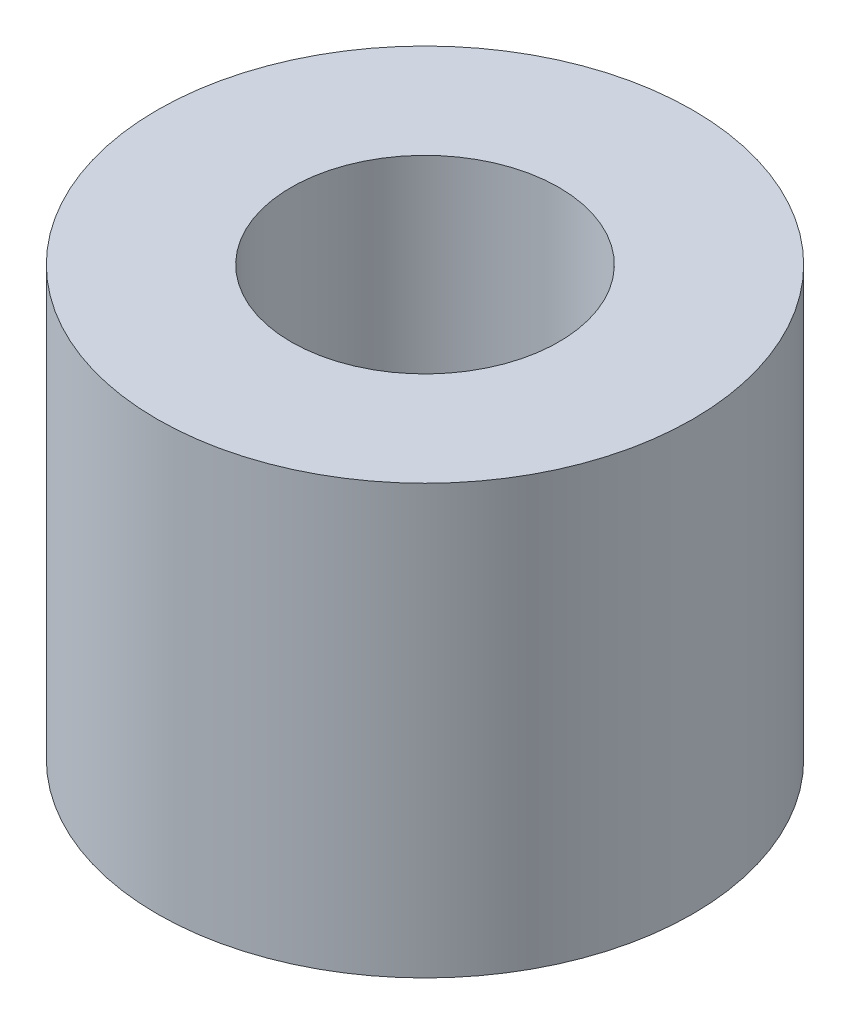
ISO-10303-21;
HEADER;
FILE_DESCRIPTION(('STEP AP214'),'2;1');
FILE_NAME('part.step','',(''),(''),'','','');
FILE_SCHEMA(('AUTOMOTIVE_DESIGN { 1 0 10303 214 1 1 1 1 }'));
ENDSEC;
DATA;
#1=APPLICATION_CONTEXT('core data for automotive mechanical design processes');
#2=APPLICATION_PROTOCOL_DEFINITION('international standard','automotive_design',2000,#1);
#3=PRODUCT_CONTEXT('',#1,'mechanical');
#4=PRODUCT('Part','Part','',(#3));
#5=PRODUCT_RELATED_PRODUCT_CATEGORY('part','',(#4));
#6=PRODUCT_DEFINITION_FORMATION('','',#4);
#7=PRODUCT_DEFINITION_CONTEXT('part definition',#1,'design');
#8=PRODUCT_DEFINITION('design','',#6,#7);
#9=PRODUCT_DEFINITION_SHAPE('','',#8);
#10=(LENGTH_UNIT() NAMED_UNIT(*) SI_UNIT(.MILLI.,.METRE.));
#11=(NAMED_UNIT(*) PLANE_ANGLE_UNIT() SI_UNIT($,.RADIAN.));
#12=(NAMED_UNIT(*) SI_UNIT($,.STERADIAN.) SOLID_ANGLE_UNIT());
#13=UNCERTAINTY_MEASURE_WITH_UNIT(LENGTH_MEASURE(1.E-05),#10,'distance_accuracy_value','');
#14=(GEOMETRIC_REPRESENTATION_CONTEXT(3) GLOBAL_UNCERTAINTY_ASSIGNED_CONTEXT((#13)) GLOBAL_UNIT_ASSIGNED_CONTEXT((#10,
#11,#12)) REPRESENTATION_CONTEXT('',''));
#15=CARTESIAN_POINT('',(0.,0.,0.));
#16=DIRECTION('',(0.,0.,1.));
#17=DIRECTION('',(1.,0.,0.));
#18=AXIS2_PLACEMENT_3D('',#15,#16,#17);
#19=CARTESIAN_POINT('',(0.,8.,0.));
#20=DIRECTION('',(0.,1.,0.));
#21=DIRECTION('',(0.,0.,1.));
#22=AXIS2_PLACEMENT_3D('',#19,#20,#21);
#23=PLANE('',#22);
#24=CARTESIAN_POINT('',(0.,8.,0.));
#25=DIRECTION('',(0.,1.,0.));
#26=DIRECTION('',(0.,0.,1.));
#27=AXIS2_PLACEMENT_3D('',#24,#25,#26);
#28=CIRCLE('',#27,5.);
#29=CARTESIAN_POINT('',(0.,8.,5.));
#30=VERTEX_POINT('',#29);
#31=EDGE_CURVE('E10',#30,#30,#28,.T.);
#32=ORIENTED_EDGE('',*,*,#31,.T.);
#33=EDGE_LOOP('',(#32));
#34=FACE_BOUND('',#33,.T.);
#35=CARTESIAN_POINT('',(0.,8.,0.));
#36=DIRECTION('',(0.,1.,0.));
#37=DIRECTION('',(0.,0.,1.));
#38=AXIS2_PLACEMENT_3D('',#35,#36,#37);
#39=CIRCLE('',#38,2.5);
#40=CARTESIAN_POINT('',(0.,8.,2.5));
#41=VERTEX_POINT('',#40);
#42=EDGE_CURVE('E53',#41,#41,#39,.T.);
#43=ORIENTED_EDGE('',*,*,#42,.F.);
#44=EDGE_LOOP('',(#43));
#45=FACE_BOUND('',#44,.T.);
#46=ADVANCED_FACE('F38',(#34,#45),#23,.T.);
#47=CARTESIAN_POINT('',(0.,0.,0.));
#48=DIRECTION('',(0.,1.,0.));
#49=DIRECTION('',(0.,0.,1.));
#50=AXIS2_PLACEMENT_3D('',#47,#48,#49);
#51=PLANE('',#50);
#52=CARTESIAN_POINT('',(0.,0.,0.));
#53=DIRECTION('',(0.,1.,0.));
#54=DIRECTION('',(0.,0.,1.));
#55=AXIS2_PLACEMENT_3D('',#52,#53,#54);
#56=CIRCLE('',#55,5.);
#57=CARTESIAN_POINT('',(0.,0.,5.));
#58=VERTEX_POINT('',#57);
#59=EDGE_CURVE('E42',#58,#58,#56,.T.);
#60=ORIENTED_EDGE('',*,*,#59,.F.);
#61=EDGE_LOOP('',(#60));
#62=FACE_BOUND('',#61,.T.);
#63=CARTESIAN_POINT('',(0.,0.,0.));
#64=DIRECTION('',(0.,1.,0.));
#65=DIRECTION('',(0.,0.,1.));
#66=AXIS2_PLACEMENT_3D('',#63,#64,#65);
#67=CIRCLE('',#66,2.5);
#68=CARTESIAN_POINT('',(0.,0.,2.5));
#69=VERTEX_POINT('',#68);
#70=EDGE_CURVE('E55',#69,#69,#67,.T.);
#71=ORIENTED_EDGE('',*,*,#70,.T.);
#72=EDGE_LOOP('',(#71));
#73=FACE_BOUND('',#72,.T.);
#74=ADVANCED_FACE('F65',(#62,#73),#51,.F.);
#75=CARTESIAN_POINT('',(0.,8.,0.));
#76=DIRECTION('',(0.,-1.,0.));
#77=DIRECTION('',(0.,0.,-1.));
#78=AXIS2_PLACEMENT_3D('',#75,#76,#77);
#79=CYLINDRICAL_SURFACE('',#78,5.);
#80=ORIENTED_EDGE('',*,*,#31,.F.);
#81=EDGE_LOOP('',(#80));
#82=FACE_BOUND('',#81,.T.);
#83=ORIENTED_EDGE('',*,*,#59,.T.);
#84=EDGE_LOOP('',(#83));
#85=FACE_BOUND('',#84,.T.);
#86=ADVANCED_FACE('F40',(#82,#85),#79,.T.);
#87=CARTESIAN_POINT('',(0.,8.,0.));
#88=DIRECTION('',(0.,-1.,0.));
#89=DIRECTION('',(0.,0.,-1.));
#90=AXIS2_PLACEMENT_3D('',#87,#88,#89);
#91=CYLINDRICAL_SURFACE('',#90,2.5);
#92=ORIENTED_EDGE('',*,*,#42,.T.);
#93=EDGE_LOOP('',(#92));
#94=FACE_BOUND('',#93,.T.);
#95=ORIENTED_EDGE('',*,*,#70,.F.);
#96=EDGE_LOOP('',(#95));
#97=FACE_BOUND('',#96,.T.);
#98=ADVANCED_FACE('F61',(#94,#97),#91,.F.);
#99=CLOSED_SHELL('',(#46,#74,#86,#98));
#100=MANIFOLD_SOLID_BREP('B2',#99);
#101=ADVANCED_BREP_SHAPE_REPRESENTATION('',(#18,#100),#14);
#102=SHAPE_DEFINITION_REPRESENTATION(#9,#101);
ENDSEC;
END-ISO-10303-21;
